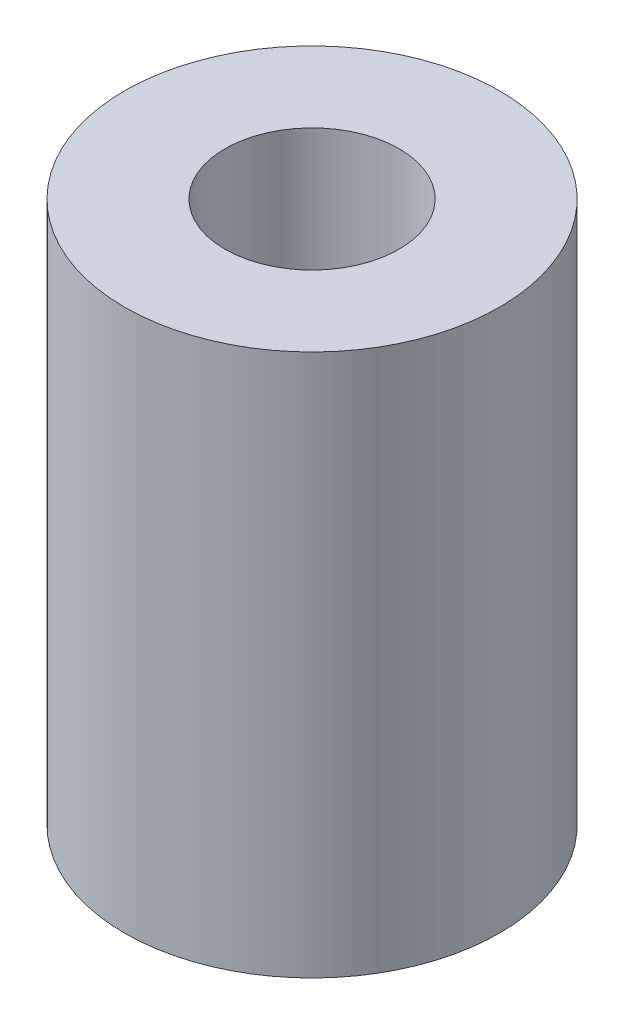
ISO-10303-21;
HEADER;
FILE_DESCRIPTION(('STEP AP214'),'2;1');
FILE_NAME('part.step','',(''),(''),'','','');
FILE_SCHEMA(('AUTOMOTIVE_DESIGN { 1 0 10303 214 1 1 1 1 }'));
ENDSEC;
DATA;
#1=APPLICATION_CONTEXT('core data for automotive mechanical design processes');
#2=APPLICATION_PROTOCOL_DEFINITION('international standard','automotive_design',2000,#1);
#3=PRODUCT_CONTEXT('',#1,'mechanical');
#4=PRODUCT('Part','Part','',(#3));
#5=PRODUCT_RELATED_PRODUCT_CATEGORY('part','',(#4));
#6=PRODUCT_DEFINITION_FORMATION('','',#4);
#7=PRODUCT_DEFINITION_CONTEXT('part definition',#1,'design');
#8=PRODUCT_DEFINITION('design','',#6,#7);
#9=PRODUCT_DEFINITION_SHAPE('','',#8);
#10=(LENGTH_UNIT() NAMED_UNIT(*) SI_UNIT(.MILLI.,.METRE.));
#11=(NAMED_UNIT(*) PLANE_ANGLE_UNIT() SI_UNIT($,.RADIAN.));
#12=(NAMED_UNIT(*) SI_UNIT($,.STERADIAN.) SOLID_ANGLE_UNIT());
#13=UNCERTAINTY_MEASURE_WITH_UNIT(LENGTH_MEASURE(1.E-05),#10,'distance_accuracy_value','');
#14=(GEOMETRIC_REPRESENTATION_CONTEXT(3) GLOBAL_UNCERTAINTY_ASSIGNED_CONTEXT((#13)) GLOBAL_UNIT_ASSIGNED_CONTEXT((#10,
#11,#12)) REPRESENTATION_CONTEXT('',''));
#15=CARTESIAN_POINT('',(0.,0.,0.));
#16=DIRECTION('',(0.,0.,1.));
#17=DIRECTION('',(1.,0.,0.));
#18=AXIS2_PLACEMENT_3D('',#15,#16,#17);
#19=CARTESIAN_POINT('',(0.,11.938,0.));
#20=DIRECTION('',(0.,1.,0.));
#21=DIRECTION('',(0.,0.,1.));
#22=AXIS2_PLACEMENT_3D('',#19,#20,#21);
#23=PLANE('',#22);
#24=CARTESIAN_POINT('',(0.,11.938,0.));
#25=DIRECTION('',(0.,1.,0.));
#26=DIRECTION('',(0.,0.,1.));
#27=AXIS2_PLACEMENT_3D('',#24,#25,#26);
#28=CIRCLE('',#27,4.1275);
#29=CARTESIAN_POINT('',(0.,11.938,4.1275));
#30=VERTEX_POINT('',#29);
#31=EDGE_CURVE('E10',#30,#30,#28,.T.);
#32=ORIENTED_EDGE('',*,*,#31,.T.);
#33=EDGE_LOOP('',(#32));
#34=FACE_BOUND('',#33,.T.);
#35=CARTESIAN_POINT('',(0.,11.938,0.));
#36=DIRECTION('',(0.,1.,0.));
#37=DIRECTION('',(0.,0.,1.));
#38=AXIS2_PLACEMENT_3D('',#35,#36,#37);
#39=CIRCLE('',#38,1.9177);
#40=CARTESIAN_POINT('',(0.,11.938,1.9177));
#41=VERTEX_POINT('',#40);
#42=EDGE_CURVE('E42',#41,#41,#39,.T.);
#43=ORIENTED_EDGE('',*,*,#42,.F.);
#44=EDGE_LOOP('',(#43));
#45=FACE_BOUND('',#44,.T.);
#46=ADVANCED_FACE('F31',(#34,#45),#23,.T.);
#47=CARTESIAN_POINT('',(0.,0.,0.));
#48=DIRECTION('',(0.,1.,0.));
#49=DIRECTION('',(0.,0.,1.));
#50=AXIS2_PLACEMENT_3D('',#47,#48,#49);
#51=PLANE('',#50);
#52=CARTESIAN_POINT('',(0.,0.,0.));
#53=DIRECTION('',(0.,1.,0.));
#54=DIRECTION('',(0.,0.,1.));
#55=AXIS2_PLACEMENT_3D('',#52,#53,#54);
#56=CIRCLE('',#55,4.1275);
#57=CARTESIAN_POINT('',(0.,0.,4.1275));
#58=VERTEX_POINT('',#57);
#59=EDGE_CURVE('E35',#58,#58,#56,.T.);
#60=ORIENTED_EDGE('',*,*,#59,.F.);
#61=EDGE_LOOP('',(#60));
#62=FACE_BOUND('',#61,.T.);
#63=CARTESIAN_POINT('',(0.,0.,0.));
#64=DIRECTION('',(0.,1.,0.));
#65=DIRECTION('',(0.,0.,1.));
#66=AXIS2_PLACEMENT_3D('',#63,#64,#65);
#67=CIRCLE('',#66,1.9177);
#68=CARTESIAN_POINT('',(0.,0.,1.9177));
#69=VERTEX_POINT('',#68);
#70=EDGE_CURVE('E44',#69,#69,#67,.T.);
#71=ORIENTED_EDGE('',*,*,#70,.T.);
#72=EDGE_LOOP('',(#71));
#73=FACE_BOUND('',#72,.T.);
#74=ADVANCED_FACE('F54',(#62,#73),#51,.F.);
#75=CARTESIAN_POINT('',(0.,11.938,0.));
#76=DIRECTION('',(0.,-1.,0.));
#77=DIRECTION('',(0.,0.,-1.));
#78=AXIS2_PLACEMENT_3D('',#75,#76,#77);
#79=CYLINDRICAL_SURFACE('',#78,4.1275);
#80=ORIENTED_EDGE('',*,*,#31,.F.);
#81=EDGE_LOOP('',(#80));
#82=FACE_BOUND('',#81,.T.);
#83=ORIENTED_EDGE('',*,*,#59,.T.);
#84=EDGE_LOOP('',(#83));
#85=FACE_BOUND('',#84,.T.);
#86=ADVANCED_FACE('F33',(#82,#85),#79,.T.);
#87=CARTESIAN_POINT('',(0.,11.938,0.));
#88=DIRECTION('',(0.,-1.,0.));
#89=DIRECTION('',(0.,0.,-1.));
#90=AXIS2_PLACEMENT_3D('',#87,#88,#89);
#91=CYLINDRICAL_SURFACE('',#90,1.9177);
#92=ORIENTED_EDGE('',*,*,#42,.T.);
#93=EDGE_LOOP('',(#92));
#94=FACE_BOUND('',#93,.T.);
#95=ORIENTED_EDGE('',*,*,#70,.F.);
#96=EDGE_LOOP('',(#95));
#97=FACE_BOUND('',#96,.T.);
#98=ADVANCED_FACE('F50',(#94,#97),#91,.F.);
#99=CLOSED_SHELL('',(#46,#74,#86,#98));
#100=MANIFOLD_SOLID_BREP('B2',#99);
#101=ADVANCED_BREP_SHAPE_REPRESENTATION('',(#18,#100),#14);
#102=SHAPE_DEFINITION_REPRESENTATION(#9,#101);
ENDSEC;
END-ISO-10303-21;
